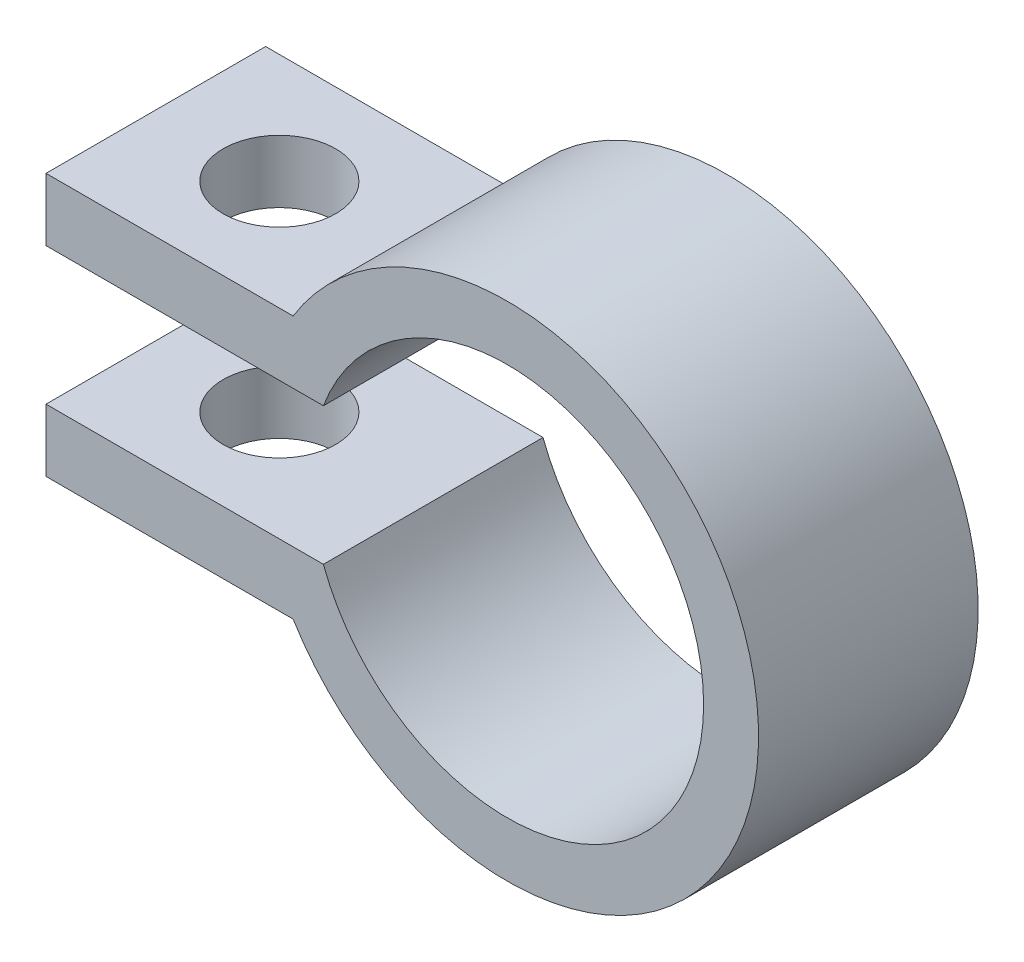
ISO-10303-21;
HEADER;
FILE_DESCRIPTION(('STEP AP214'),'2;1');
FILE_NAME('part.step','',(''),(''),'','','');
FILE_SCHEMA(('AUTOMOTIVE_DESIGN { 1 0 10303 214 1 1 1 1 }'));
ENDSEC;
DATA;
#1=APPLICATION_CONTEXT('core data for automotive mechanical design processes');
#2=APPLICATION_PROTOCOL_DEFINITION('international standard','automotive_design',2000,#1);
#3=PRODUCT_CONTEXT('',#1,'mechanical');
#4=PRODUCT('Part','Part','',(#3));
#5=PRODUCT_RELATED_PRODUCT_CATEGORY('part','',(#4));
#6=PRODUCT_DEFINITION_FORMATION('','',#4);
#7=PRODUCT_DEFINITION_CONTEXT('part definition',#1,'design');
#8=PRODUCT_DEFINITION('design','',#6,#7);
#9=PRODUCT_DEFINITION_SHAPE('','',#8);
#10=(LENGTH_UNIT() NAMED_UNIT(*) SI_UNIT(.MILLI.,.METRE.));
#11=(NAMED_UNIT(*) PLANE_ANGLE_UNIT() SI_UNIT($,.RADIAN.));
#12=(NAMED_UNIT(*) SI_UNIT($,.STERADIAN.) SOLID_ANGLE_UNIT());
#13=UNCERTAINTY_MEASURE_WITH_UNIT(LENGTH_MEASURE(1.E-05),#10,'distance_accuracy_value','');
#14=(GEOMETRIC_REPRESENTATION_CONTEXT(3) GLOBAL_UNCERTAINTY_ASSIGNED_CONTEXT((#13)) GLOBAL_UNIT_ASSIGNED_CONTEXT((#10,
#11,#12)) REPRESENTATION_CONTEXT('',''));
#15=CARTESIAN_POINT('',(0.,0.,0.));
#16=DIRECTION('',(0.,0.,1.));
#17=DIRECTION('',(1.,0.,0.));
#18=AXIS2_PLACEMENT_3D('',#15,#16,#17);
#19=CARTESIAN_POINT('',(0.,-4.7805536075241,8.));
#20=DIRECTION('',(0.,1.,0.));
#21=DIRECTION('',(0.,0.,1.));
#22=AXIS2_PLACEMENT_3D('',#19,#20,#21);
#23=PLANE('',#22);
#24=CARTESIAN_POINT('',(-12.3018463972055,-4.7805536075241,4.));
#25=DIRECTION('',(0.,1.,0.));
#26=DIRECTION('',(0.,0.,1.));
#27=AXIS2_PLACEMENT_3D('',#24,#25,#26);
#28=CIRCLE('',#27,2.05);
#29=CARTESIAN_POINT('',(-12.3018463972055,-4.7805536075241,6.05));
#30=VERTEX_POINT('',#29);
#31=EDGE_CURVE('E139',#30,#30,#28,.T.);
#32=ORIENTED_EDGE('',*,*,#31,.T.);
#33=EDGE_LOOP('',(#32));
#34=FACE_BOUND('',#33,.T.);
#35=DIRECTION('',(1.,0.,0.));
#36=VECTOR('',#35,1.);
#37=CARTESIAN_POINT('',(0.,-4.7805536075241,0.));
#38=LINE('',#37,#36);
#39=CARTESIAN_POINT('',(-16.8018463972055,-4.7805536075241,0.));
#40=VERTEX_POINT('',#39);
#41=CARTESIAN_POINT('',(-7.80184639720553,-4.7805536075241,0.));
#42=VERTEX_POINT('',#41);
#43=EDGE_CURVE('E135',#40,#42,#38,.T.);
#44=ORIENTED_EDGE('',*,*,#43,.T.);
#45=DIRECTION('',(0.,0.,-1.));
#46=VECTOR('',#45,1.);
#47=CARTESIAN_POINT('',(-7.80184639720553,-4.7805536075241,8.));
#48=LINE('',#47,#46);
#49=CARTESIAN_POINT('',(-7.80184639720553,-4.7805536075241,8.));
#50=VERTEX_POINT('',#49);
#51=EDGE_CURVE('E11',#50,#42,#48,.T.);
#52=ORIENTED_EDGE('',*,*,#51,.F.);
#53=DIRECTION('',(1.,0.,0.));
#54=VECTOR('',#53,1.);
#55=CARTESIAN_POINT('',(0.,-4.7805536075241,8.));
#56=LINE('',#55,#54);
#57=CARTESIAN_POINT('',(-16.8018463972055,-4.7805536075241,8.));
#58=VERTEX_POINT('',#57);
#59=EDGE_CURVE('E155',#58,#50,#56,.T.);
#60=ORIENTED_EDGE('',*,*,#59,.F.);
#61=DIRECTION('',(0.,0.,-1.));
#62=VECTOR('',#61,1.);
#63=CARTESIAN_POINT('',(-16.8018463972055,-4.7805536075241,8.));
#64=LINE('',#63,#62);
#65=EDGE_CURVE('E131',#58,#40,#64,.T.);
#66=ORIENTED_EDGE('',*,*,#65,.T.);
#67=EDGE_LOOP('',(#44,#52,#60,#66));
#68=FACE_BOUND('',#67,.T.);
#69=ADVANCED_FACE('F39',(#34,#68),#23,.F.);
#70=CARTESIAN_POINT('',(0.,0.,8.));
#71=DIRECTION('',(0.,0.,-1.));
#72=DIRECTION('',(-1.,0.,0.));
#73=AXIS2_PLACEMENT_3D('',#70,#71,#72);
#74=CYLINDRICAL_SURFACE('',#73,9.15000000000003);
#75=CARTESIAN_POINT('',(0.,0.,0.));
#76=DIRECTION('',(0.,0.,1.));
#77=DIRECTION('',(1.,0.,0.));
#78=AXIS2_PLACEMENT_3D('',#75,#76,#77);
#79=CIRCLE('',#78,9.15000000000003);
#80=CARTESIAN_POINT('',(-7.80184639720553,4.7805536075241,0.));
#81=VERTEX_POINT('',#80);
#82=EDGE_CURVE('E138',#42,#81,#79,.T.);
#83=ORIENTED_EDGE('',*,*,#82,.T.);
#84=DIRECTION('',(0.,0.,-1.));
#85=VECTOR('',#84,1.);
#86=CARTESIAN_POINT('',(-7.80184639720553,4.7805536075241,8.));
#87=LINE('',#86,#85);
#88=CARTESIAN_POINT('',(-7.80184639720553,4.7805536075241,8.));
#89=VERTEX_POINT('',#88);
#90=EDGE_CURVE('E48',#89,#81,#87,.T.);
#91=ORIENTED_EDGE('',*,*,#90,.F.);
#92=CARTESIAN_POINT('',(0.,0.,8.));
#93=DIRECTION('',(0.,0.,1.));
#94=DIRECTION('',(1.,0.,0.));
#95=AXIS2_PLACEMENT_3D('',#92,#93,#94);
#96=CIRCLE('',#95,9.15000000000003);
#97=EDGE_CURVE('E95',#50,#89,#96,.T.);
#98=ORIENTED_EDGE('',*,*,#97,.F.);
#99=ORIENTED_EDGE('',*,*,#51,.T.);
#100=EDGE_LOOP('',(#83,#91,#98,#99));
#101=FACE_BOUND('',#100,.T.);
#102=ADVANCED_FACE('F169',(#101),#74,.T.);
#103=CARTESIAN_POINT('',(0.,4.7805536075241,8.));
#104=DIRECTION('',(0.,1.,0.));
#105=DIRECTION('',(0.,0.,1.));
#106=AXIS2_PLACEMENT_3D('',#103,#104,#105);
#107=PLANE('',#106);
#108=CARTESIAN_POINT('',(-12.3018463972055,4.7805536075241,4.));
#109=DIRECTION('',(0.,1.,0.));
#110=DIRECTION('',(0.,0.,1.));
#111=AXIS2_PLACEMENT_3D('',#108,#109,#110);
#112=CIRCLE('',#111,2.05);
#113=CARTESIAN_POINT('',(-12.3018463972055,4.7805536075241,6.05));
#114=VERTEX_POINT('',#113);
#115=EDGE_CURVE('E190',#114,#114,#112,.T.);
#116=ORIENTED_EDGE('',*,*,#115,.F.);
#117=EDGE_LOOP('',(#116));
#118=FACE_BOUND('',#117,.T.);
#119=DIRECTION('',(1.,0.,0.));
#120=VECTOR('',#119,1.);
#121=CARTESIAN_POINT('',(0.,4.7805536075241,0.));
#122=LINE('',#121,#120);
#123=CARTESIAN_POINT('',(-16.8018463972055,4.7805536075241,0.));
#124=VERTEX_POINT('',#123);
#125=EDGE_CURVE('E142',#124,#81,#122,.T.);
#126=ORIENTED_EDGE('',*,*,#125,.F.);
#127=DIRECTION('',(0.,0.,-1.));
#128=VECTOR('',#127,1.);
#129=CARTESIAN_POINT('',(-16.8018463972055,4.7805536075241,8.));
#130=LINE('',#129,#128);
#131=CARTESIAN_POINT('',(-16.8018463972055,4.7805536075241,8.));
#132=VERTEX_POINT('',#131);
#133=EDGE_CURVE('E161',#132,#124,#130,.T.);
#134=ORIENTED_EDGE('',*,*,#133,.F.);
#135=DIRECTION('',(1.,0.,0.));
#136=VECTOR('',#135,1.);
#137=CARTESIAN_POINT('',(0.,4.7805536075241,8.));
#138=LINE('',#137,#136);
#139=EDGE_CURVE('E168',#132,#89,#138,.T.);
#140=ORIENTED_EDGE('',*,*,#139,.T.);
#141=ORIENTED_EDGE('',*,*,#90,.T.);
#142=EDGE_LOOP('',(#126,#134,#140,#141));
#143=FACE_BOUND('',#142,.T.);
#144=ADVANCED_FACE('F166',(#118,#143),#107,.T.);
#145=CARTESIAN_POINT('',(-16.8018463972055,0.,8.));
#146=DIRECTION('',(-1.,0.,0.));
#147=DIRECTION('',(0.,-1.,0.));
#148=AXIS2_PLACEMENT_3D('',#145,#146,#147);
#149=PLANE('',#148);
#150=DIRECTION('',(0.,1.,0.));
#151=VECTOR('',#150,1.);
#152=CARTESIAN_POINT('',(-16.8018463972055,0.,0.));
#153=LINE('',#152,#151);
#154=CARTESIAN_POINT('',(-16.8018463972055,2.5,0.));
#155=VERTEX_POINT('',#154);
#156=EDGE_CURVE('E145',#155,#124,#153,.T.);
#157=ORIENTED_EDGE('',*,*,#156,.F.);
#158=DIRECTION('',(0.,0.,-1.));
#159=VECTOR('',#158,1.);
#160=CARTESIAN_POINT('',(-16.8018463972055,2.5,8.));
#161=LINE('',#160,#159);
#162=CARTESIAN_POINT('',(-16.8018463972055,2.5,8.));
#163=VERTEX_POINT('',#162);
#164=EDGE_CURVE('E159',#163,#155,#161,.T.);
#165=ORIENTED_EDGE('',*,*,#164,.F.);
#166=DIRECTION('',(0.,1.,0.));
#167=VECTOR('',#166,1.);
#168=CARTESIAN_POINT('',(-16.8018463972055,0.,8.));
#169=LINE('',#168,#167);
#170=EDGE_CURVE('E179',#163,#132,#169,.T.);
#171=ORIENTED_EDGE('',*,*,#170,.T.);
#172=ORIENTED_EDGE('',*,*,#133,.T.);
#173=EDGE_LOOP('',(#157,#165,#171,#172));
#174=FACE_BOUND('',#173,.T.);
#175=ADVANCED_FACE('F177',(#174),#149,.T.);
#176=CARTESIAN_POINT('',(0.,2.5,8.));
#177=DIRECTION('',(0.,1.,0.));
#178=DIRECTION('',(0.,0.,1.));
#179=AXIS2_PLACEMENT_3D('',#176,#177,#178);
#180=PLANE('',#179);
#181=CARTESIAN_POINT('',(-12.3018463972055,2.5,4.));
#182=DIRECTION('',(0.,1.,0.));
#183=DIRECTION('',(0.,0.,1.));
#184=AXIS2_PLACEMENT_3D('',#181,#182,#183);
#185=CIRCLE('',#184,2.05);
#186=CARTESIAN_POINT('',(-12.3018463972055,2.5,6.05));
#187=VERTEX_POINT('',#186);
#188=EDGE_CURVE('E187',#187,#187,#185,.T.);
#189=ORIENTED_EDGE('',*,*,#188,.T.);
#190=EDGE_LOOP('',(#189));
#191=FACE_BOUND('',#190,.T.);
#192=DIRECTION('',(1.,0.,0.));
#193=VECTOR('',#192,1.);
#194=CARTESIAN_POINT('',(0.,2.5,0.));
#195=LINE('',#194,#193);
#196=CARTESIAN_POINT('',(-6.69869390254548,2.5,0.));
#197=VERTEX_POINT('',#196);
#198=EDGE_CURVE('E148',#155,#197,#195,.T.);
#199=ORIENTED_EDGE('',*,*,#198,.T.);
#200=DIRECTION('',(0.,0.,-1.));
#201=VECTOR('',#200,1.);
#202=CARTESIAN_POINT('',(-6.69869390254548,2.5,8.));
#203=LINE('',#202,#201);
#204=CARTESIAN_POINT('',(-6.69869390254548,2.5,8.));
#205=VERTEX_POINT('',#204);
#206=EDGE_CURVE('E120',#205,#197,#203,.T.);
#207=ORIENTED_EDGE('',*,*,#206,.F.);
#208=DIRECTION('',(1.,0.,0.));
#209=VECTOR('',#208,1.);
#210=CARTESIAN_POINT('',(0.,2.5,8.));
#211=LINE('',#210,#209);
#212=EDGE_CURVE('E126',#163,#205,#211,.T.);
#213=ORIENTED_EDGE('',*,*,#212,.F.);
#214=ORIENTED_EDGE('',*,*,#164,.T.);
#215=EDGE_LOOP('',(#199,#207,#213,#214));
#216=FACE_BOUND('',#215,.T.);
#217=ADVANCED_FACE('F210',(#191,#216),#180,.F.);
#218=CARTESIAN_POINT('',(0.,0.,8.));
#219=DIRECTION('',(0.,0.,-1.));
#220=DIRECTION('',(-1.,0.,0.));
#221=AXIS2_PLACEMENT_3D('',#218,#219,#220);
#222=CYLINDRICAL_SURFACE('',#221,7.15);
#223=CARTESIAN_POINT('',(0.,0.,0.));
#224=DIRECTION('',(0.,0.,1.));
#225=DIRECTION('',(1.,0.,0.));
#226=AXIS2_PLACEMENT_3D('',#223,#224,#225);
#227=CIRCLE('',#226,7.15);
#228=CARTESIAN_POINT('',(-6.69869390254548,-2.5,0.));
#229=VERTEX_POINT('',#228);
#230=EDGE_CURVE('E115',#229,#197,#227,.T.);
#231=ORIENTED_EDGE('',*,*,#230,.F.);
#232=DIRECTION('',(0.,0.,-1.));
#233=VECTOR('',#232,1.);
#234=CARTESIAN_POINT('',(-6.69869390254548,-2.5,8.));
#235=LINE('',#234,#233);
#236=CARTESIAN_POINT('',(-6.69869390254548,-2.5,8.));
#237=VERTEX_POINT('',#236);
#238=EDGE_CURVE('E110',#237,#229,#235,.T.);
#239=ORIENTED_EDGE('',*,*,#238,.F.);
#240=CARTESIAN_POINT('',(0.,0.,8.));
#241=DIRECTION('',(0.,0.,1.));
#242=DIRECTION('',(1.,0.,0.));
#243=AXIS2_PLACEMENT_3D('',#240,#241,#242);
#244=CIRCLE('',#243,7.15);
#245=EDGE_CURVE('E113',#237,#205,#244,.T.);
#246=ORIENTED_EDGE('',*,*,#245,.T.);
#247=ORIENTED_EDGE('',*,*,#206,.T.);
#248=EDGE_LOOP('',(#231,#239,#246,#247));
#249=FACE_BOUND('',#248,.T.);
#250=ADVANCED_FACE('F112',(#249),#222,.F.);
#251=CARTESIAN_POINT('',(0.,-2.5,8.));
#252=DIRECTION('',(0.,1.,0.));
#253=DIRECTION('',(0.,0.,1.));
#254=AXIS2_PLACEMENT_3D('',#251,#252,#253);
#255=PLANE('',#254);
#256=CARTESIAN_POINT('',(-12.3018463972055,-2.5,4.));
#257=DIRECTION('',(0.,1.,0.));
#258=DIRECTION('',(0.,0.,1.));
#259=AXIS2_PLACEMENT_3D('',#256,#257,#258);
#260=CIRCLE('',#259,2.05);
#261=CARTESIAN_POINT('',(-12.3018463972055,-2.5,6.05));
#262=VERTEX_POINT('',#261);
#263=EDGE_CURVE('E42',#262,#262,#260,.T.);
#264=ORIENTED_EDGE('',*,*,#263,.F.);
#265=EDGE_LOOP('',(#264));
#266=FACE_BOUND('',#265,.T.);
#267=DIRECTION('',(1.,0.,0.));
#268=VECTOR('',#267,1.);
#269=CARTESIAN_POINT('',(0.,-2.5,0.));
#270=LINE('',#269,#268);
#271=CARTESIAN_POINT('',(-16.8018463972055,-2.5,0.));
#272=VERTEX_POINT('',#271);
#273=EDGE_CURVE('E152',#272,#229,#270,.T.);
#274=ORIENTED_EDGE('',*,*,#273,.F.);
#275=DIRECTION('',(0.,0.,-1.));
#276=VECTOR('',#275,1.);
#277=CARTESIAN_POINT('',(-16.8018463972055,-2.5,8.));
#278=LINE('',#277,#276);
#279=CARTESIAN_POINT('',(-16.8018463972055,-2.5,8.));
#280=VERTEX_POINT('',#279);
#281=EDGE_CURVE('E84',#280,#272,#278,.T.);
#282=ORIENTED_EDGE('',*,*,#281,.F.);
#283=DIRECTION('',(1.,0.,0.));
#284=VECTOR('',#283,1.);
#285=CARTESIAN_POINT('',(0.,-2.5,8.));
#286=LINE('',#285,#284);
#287=EDGE_CURVE('E123',#280,#237,#286,.T.);
#288=ORIENTED_EDGE('',*,*,#287,.T.);
#289=ORIENTED_EDGE('',*,*,#238,.T.);
#290=EDGE_LOOP('',(#274,#282,#288,#289));
#291=FACE_BOUND('',#290,.T.);
#292=ADVANCED_FACE('F129',(#266,#291),#255,.T.);
#293=CARTESIAN_POINT('',(-16.8018463972055,0.,8.));
#294=DIRECTION('',(1.,0.,0.));
#295=DIRECTION('',(0.,1.,0.));
#296=AXIS2_PLACEMENT_3D('',#293,#294,#295);
#297=PLANE('',#296);
#298=DIRECTION('',(0.,-1.,0.));
#299=VECTOR('',#298,1.);
#300=CARTESIAN_POINT('',(-16.8018463972055,0.,0.));
#301=LINE('',#300,#299);
#302=EDGE_CURVE('E87',#272,#40,#301,.T.);
#303=ORIENTED_EDGE('',*,*,#302,.T.);
#304=ORIENTED_EDGE('',*,*,#65,.F.);
#305=DIRECTION('',(0.,-1.,0.));
#306=VECTOR('',#305,1.);
#307=CARTESIAN_POINT('',(-16.8018463972055,0.,8.));
#308=LINE('',#307,#306);
#309=EDGE_CURVE('E56',#280,#58,#308,.T.);
#310=ORIENTED_EDGE('',*,*,#309,.F.);
#311=ORIENTED_EDGE('',*,*,#281,.T.);
#312=EDGE_LOOP('',(#303,#304,#310,#311));
#313=FACE_BOUND('',#312,.T.);
#314=ADVANCED_FACE('F201',(#313),#297,.F.);
#315=CARTESIAN_POINT('',(0.,0.,8.));
#316=DIRECTION('',(0.,0.,1.));
#317=DIRECTION('',(1.,0.,0.));
#318=AXIS2_PLACEMENT_3D('',#315,#316,#317);
#319=PLANE('',#318);
#320=ORIENTED_EDGE('',*,*,#59,.T.);
#321=ORIENTED_EDGE('',*,*,#97,.T.);
#322=ORIENTED_EDGE('',*,*,#139,.F.);
#323=ORIENTED_EDGE('',*,*,#170,.F.);
#324=ORIENTED_EDGE('',*,*,#212,.T.);
#325=ORIENTED_EDGE('',*,*,#245,.F.);
#326=ORIENTED_EDGE('',*,*,#287,.F.);
#327=ORIENTED_EDGE('',*,*,#309,.T.);
#328=EDGE_LOOP('',(#320,#321,#322,#323,#324,#325,#326,#327));
#329=FACE_BOUND('',#328,.T.);
#330=ADVANCED_FACE('F122',(#329),#319,.T.);
#331=CARTESIAN_POINT('',(0.,0.,0.));
#332=DIRECTION('',(0.,0.,1.));
#333=DIRECTION('',(1.,0.,0.));
#334=AXIS2_PLACEMENT_3D('',#331,#332,#333);
#335=PLANE('',#334);
#336=ORIENTED_EDGE('',*,*,#43,.F.);
#337=ORIENTED_EDGE('',*,*,#302,.F.);
#338=ORIENTED_EDGE('',*,*,#273,.T.);
#339=ORIENTED_EDGE('',*,*,#230,.T.);
#340=ORIENTED_EDGE('',*,*,#198,.F.);
#341=ORIENTED_EDGE('',*,*,#156,.T.);
#342=ORIENTED_EDGE('',*,*,#125,.T.);
#343=ORIENTED_EDGE('',*,*,#82,.F.);
#344=EDGE_LOOP('',(#336,#337,#338,#339,#340,#341,#342,#343));
#345=FACE_BOUND('',#344,.T.);
#346=ADVANCED_FACE('F173',(#345),#335,.F.);
#347=CARTESIAN_POINT('',(-12.3018463972055,-13.7194463924759,4.));
#348=DIRECTION('',(0.,1.,0.));
#349=DIRECTION('',(0.,0.,1.));
#350=AXIS2_PLACEMENT_3D('',#347,#348,#349);
#351=CYLINDRICAL_SURFACE('',#350,2.05);
#352=ORIENTED_EDGE('',*,*,#263,.T.);
#353=EDGE_LOOP('',(#352));
#354=FACE_BOUND('',#353,.T.);
#355=ORIENTED_EDGE('',*,*,#31,.F.);
#356=EDGE_LOOP('',(#355));
#357=FACE_BOUND('',#356,.T.);
#358=ADVANCED_FACE('F197',(#354,#357),#351,.F.);
#359=ORIENTED_EDGE('',*,*,#115,.T.);
#360=EDGE_LOOP('',(#359));
#361=FACE_BOUND('',#360,.T.);
#362=ORIENTED_EDGE('',*,*,#188,.F.);
#363=EDGE_LOOP('',(#362));
#364=FACE_BOUND('',#363,.T.);
#365=ADVANCED_FACE('F222',(#361,#364),#351,.F.);
#366=CLOSED_SHELL('',(#69,#102,#144,#175,#217,#250,#292,#314,#330,#346,#358,#365));
#367=MANIFOLD_SOLID_BREP('B2',#366);
#368=ADVANCED_BREP_SHAPE_REPRESENTATION('',(#18,#367),#14);
#369=SHAPE_DEFINITION_REPRESENTATION(#9,#368);
ENDSEC;
END-ISO-10303-21;
